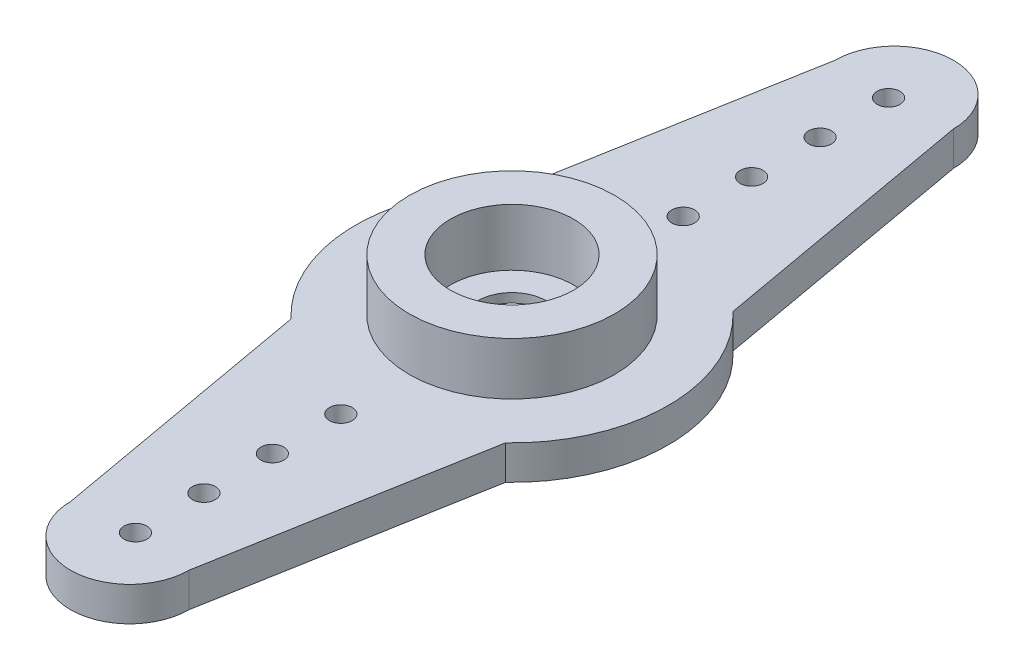
ISO-10303-21;
HEADER;
FILE_DESCRIPTION(('STEP AP214'),'2;1');
FILE_NAME('part.step','',(''),(''),'','','');
FILE_SCHEMA(('AUTOMOTIVE_DESIGN { 1 0 10303 214 1 1 1 1 }'));
ENDSEC;
DATA;
#1=APPLICATION_CONTEXT('core data for automotive mechanical design processes');
#2=APPLICATION_PROTOCOL_DEFINITION('international standard','automotive_design',2000,#1);
#3=PRODUCT_CONTEXT('',#1,'mechanical');
#4=PRODUCT('Part','Part','',(#3));
#5=PRODUCT_RELATED_PRODUCT_CATEGORY('part','',(#4));
#6=PRODUCT_DEFINITION_FORMATION('','',#4);
#7=PRODUCT_DEFINITION_CONTEXT('part definition',#1,'design');
#8=PRODUCT_DEFINITION('design','',#6,#7);
#9=PRODUCT_DEFINITION_SHAPE('','',#8);
#10=(LENGTH_UNIT() NAMED_UNIT(*) SI_UNIT(.MILLI.,.METRE.));
#11=(NAMED_UNIT(*) PLANE_ANGLE_UNIT() SI_UNIT($,.RADIAN.));
#12=(NAMED_UNIT(*) SI_UNIT($,.STERADIAN.) SOLID_ANGLE_UNIT());
#13=UNCERTAINTY_MEASURE_WITH_UNIT(LENGTH_MEASURE(1.E-05),#10,'distance_accuracy_value','');
#14=(GEOMETRIC_REPRESENTATION_CONTEXT(3) GLOBAL_UNCERTAINTY_ASSIGNED_CONTEXT((#13)) GLOBAL_UNIT_ASSIGNED_CONTEXT((#10,
#11,#12)) REPRESENTATION_CONTEXT('',''));
#15=CARTESIAN_POINT('',(0.,0.,0.));
#16=DIRECTION('',(0.,0.,1.));
#17=DIRECTION('',(1.,0.,0.));
#18=AXIS2_PLACEMENT_3D('',#15,#16,#17);
#19=CARTESIAN_POINT('',(0.,3.8,0.));
#20=DIRECTION('',(0.,-1.,0.));
#21=DIRECTION('',(0.,0.,-1.));
#22=AXIS2_PLACEMENT_3D('',#19,#20,#21);
#23=CYLINDRICAL_SURFACE('',#22,1.5);
#24=CARTESIAN_POINT('',(0.,0.9,0.));
#25=DIRECTION('',(0.,-1.,0.));
#26=DIRECTION('',(0.,0.,-1.));
#27=AXIS2_PLACEMENT_3D('',#24,#25,#26);
#28=CIRCLE('',#27,1.5);
#29=CARTESIAN_POINT('',(0.,0.9,-1.5));
#30=VERTEX_POINT('',#29);
#31=EDGE_CURVE('E240',#30,#30,#28,.T.);
#32=ORIENTED_EDGE('',*,*,#31,.T.);
#33=EDGE_LOOP('',(#32));
#34=FACE_BOUND('',#33,.T.);
#35=CARTESIAN_POINT('',(0.,1.3,0.));
#36=DIRECTION('',(0.,1.,0.));
#37=DIRECTION('',(0.,0.,1.));
#38=AXIS2_PLACEMENT_3D('',#35,#36,#37);
#39=CIRCLE('',#38,1.5);
#40=CARTESIAN_POINT('',(0.,1.3,1.5));
#41=VERTEX_POINT('',#40);
#42=EDGE_CURVE('E38',#41,#41,#39,.F.);
#43=ORIENTED_EDGE('',*,*,#42,.F.);
#44=EDGE_LOOP('',(#43));
#45=FACE_BOUND('',#44,.T.);
#46=ADVANCED_FACE('F34',(#34,#45),#23,.F.);
#47=CARTESIAN_POINT('',(0.,1.5,-16.75));
#48=DIRECTION('',(0.,1.,0.));
#49=DIRECTION('',(0.,0.,1.));
#50=AXIS2_PLACEMENT_3D('',#47,#48,#49);
#51=PLANE('',#50);
#52=CARTESIAN_POINT('',(0.,1.5,-16.5));
#53=DIRECTION('',(0.,1.,0.));
#54=DIRECTION('',(0.,0.,1.));
#55=AXIS2_PLACEMENT_3D('',#52,#53,#54);
#56=CIRCLE('',#55,0.500000000000001);
#57=CARTESIAN_POINT('',(0.,1.5,-16.));
#58=VERTEX_POINT('',#57);
#59=EDGE_CURVE('E222',#58,#58,#56,.T.);
#60=ORIENTED_EDGE('',*,*,#59,.F.);
#61=EDGE_LOOP('',(#60));
#62=FACE_BOUND('',#61,.T.);
#63=CARTESIAN_POINT('',(0.,1.5,-10.5));
#64=DIRECTION('',(0.,1.,0.));
#65=DIRECTION('',(0.,0.,1.));
#66=AXIS2_PLACEMENT_3D('',#63,#64,#65);
#67=CIRCLE('',#66,0.5);
#68=CARTESIAN_POINT('',(0.,1.5,-10.));
#69=VERTEX_POINT('',#68);
#70=EDGE_CURVE('E210',#69,#69,#67,.T.);
#71=ORIENTED_EDGE('',*,*,#70,.F.);
#72=EDGE_LOOP('',(#71));
#73=FACE_BOUND('',#72,.T.);
#74=CARTESIAN_POINT('',(0.,1.5,7.5));
#75=DIRECTION('',(0.,1.,0.));
#76=DIRECTION('',(0.,0.,-1.));
#77=AXIS2_PLACEMENT_3D('',#74,#75,#76);
#78=CIRCLE('',#77,0.5);
#79=CARTESIAN_POINT('',(0.,1.5,7.));
#80=VERTEX_POINT('',#79);
#81=EDGE_CURVE('E198',#80,#80,#78,.T.);
#82=ORIENTED_EDGE('',*,*,#81,.F.);
#83=EDGE_LOOP('',(#82));
#84=FACE_BOUND('',#83,.T.);
#85=CARTESIAN_POINT('',(0.,1.5,13.5));
#86=DIRECTION('',(0.,1.,0.));
#87=DIRECTION('',(0.,0.,-1.));
#88=AXIS2_PLACEMENT_3D('',#85,#86,#87);
#89=CIRCLE('',#88,0.500000000000001);
#90=CARTESIAN_POINT('',(0.,1.5,13.));
#91=VERTEX_POINT('',#90);
#92=EDGE_CURVE('E186',#91,#91,#89,.T.);
#93=ORIENTED_EDGE('',*,*,#92,.F.);
#94=EDGE_LOOP('',(#93));
#95=FACE_BOUND('',#94,.T.);
#96=CARTESIAN_POINT('',(0.,1.5,-16.75));
#97=DIRECTION('',(0.,1.,0.));
#98=DIRECTION('',(0.,0.,1.));
#99=AXIS2_PLACEMENT_3D('',#96,#97,#98);
#100=CIRCLE('',#99,2.6);
#101=CARTESIAN_POINT('',(2.6,1.5,-16.75));
#102=VERTEX_POINT('',#101);
#103=CARTESIAN_POINT('',(-2.6,1.5,-16.75));
#104=VERTEX_POINT('',#103);
#105=EDGE_CURVE('E148',#102,#104,#100,.T.);
#106=ORIENTED_EDGE('',*,*,#105,.T.);
#107=DIRECTION('',(-0.175692502443579,0.,0.98444509475395));
#108=VECTOR('',#107,1.);
#109=CARTESIAN_POINT('',(-2.6,1.5,-16.75));
#110=LINE('',#109,#108);
#111=CARTESIAN_POINT('',(-4.7,1.5,-4.98322184936613));
#112=VERTEX_POINT('',#111);
#113=EDGE_CURVE('E95',#104,#112,#110,.T.);
#114=ORIENTED_EDGE('',*,*,#113,.T.);
#115=CARTESIAN_POINT('',(0.,1.5,0.));
#116=DIRECTION('',(0.,1.,0.));
#117=DIRECTION('',(0.,0.,1.));
#118=AXIS2_PLACEMENT_3D('',#115,#116,#117);
#119=CIRCLE('',#118,6.85);
#120=CARTESIAN_POINT('',(-4.7,1.5,4.98322184936613));
#121=VERTEX_POINT('',#120);
#122=EDGE_CURVE('E164',#112,#121,#119,.T.);
#123=ORIENTED_EDGE('',*,*,#122,.T.);
#124=DIRECTION('',(0.175692502443579,0.,0.98444509475395));
#125=VECTOR('',#124,1.);
#126=CARTESIAN_POINT('',(-2.6,1.5,16.75));
#127=LINE('',#126,#125);
#128=CARTESIAN_POINT('',(-2.6,1.5,16.75));
#129=VERTEX_POINT('',#128);
#130=EDGE_CURVE('E177',#121,#129,#127,.T.);
#131=ORIENTED_EDGE('',*,*,#130,.T.);
#132=CARTESIAN_POINT('',(0.,1.5,16.75));
#133=DIRECTION('',(0.,1.,0.));
#134=DIRECTION('',(0.,0.,-1.));
#135=AXIS2_PLACEMENT_3D('',#132,#133,#134);
#136=CIRCLE('',#135,2.6);
#137=CARTESIAN_POINT('',(2.59999999999999,1.5,16.75));
#138=VERTEX_POINT('',#137);
#139=EDGE_CURVE('E115',#129,#138,#136,.T.);
#140=ORIENTED_EDGE('',*,*,#139,.T.);
#141=DIRECTION('',(0.17569250244358,0.,-0.98444509475395));
#142=VECTOR('',#141,1.);
#143=CARTESIAN_POINT('',(2.59999999999999,1.5,16.75));
#144=LINE('',#143,#142);
#145=CARTESIAN_POINT('',(4.7,1.5,4.98322184936613));
#146=VERTEX_POINT('',#145);
#147=EDGE_CURVE('E108',#138,#146,#144,.T.);
#148=ORIENTED_EDGE('',*,*,#147,.T.);
#149=CARTESIAN_POINT('',(0.,1.5,0.));
#150=DIRECTION('',(0.,1.,0.));
#151=DIRECTION('',(0.,0.,1.));
#152=AXIS2_PLACEMENT_3D('',#149,#150,#151);
#153=CIRCLE('',#152,6.85);
#154=CARTESIAN_POINT('',(4.7,1.5,-4.98322184936613));
#155=VERTEX_POINT('',#154);
#156=EDGE_CURVE('E113',#146,#155,#153,.T.);
#157=ORIENTED_EDGE('',*,*,#156,.T.);
#158=DIRECTION('',(-0.175692502443579,0.,-0.98444509475395));
#159=VECTOR('',#158,1.);
#160=CARTESIAN_POINT('',(2.6,1.5,-16.75));
#161=LINE('',#160,#159);
#162=EDGE_CURVE('E52',#155,#102,#161,.T.);
#163=ORIENTED_EDGE('',*,*,#162,.T.);
#164=EDGE_LOOP('',(#106,#114,#123,#131,#140,#148,#157,#163));
#165=FACE_BOUND('',#164,.T.);
#166=CARTESIAN_POINT('',(0.,1.5,16.5));
#167=DIRECTION('',(0.,1.,0.));
#168=DIRECTION('',(0.,0.,-1.));
#169=AXIS2_PLACEMENT_3D('',#166,#167,#168);
#170=CIRCLE('',#169,0.500000000000001);
#171=CARTESIAN_POINT('',(0.,1.5,16.));
#172=VERTEX_POINT('',#171);
#173=EDGE_CURVE('E137',#172,#172,#170,.T.);
#174=ORIENTED_EDGE('',*,*,#173,.F.);
#175=EDGE_LOOP('',(#174));
#176=FACE_BOUND('',#175,.T.);
#177=CARTESIAN_POINT('',(0.,1.5,10.5));
#178=DIRECTION('',(0.,1.,0.));
#179=DIRECTION('',(0.,0.,-1.));
#180=AXIS2_PLACEMENT_3D('',#177,#178,#179);
#181=CIRCLE('',#180,0.5);
#182=CARTESIAN_POINT('',(0.,1.5,10.));
#183=VERTEX_POINT('',#182);
#184=EDGE_CURVE('E192',#183,#183,#181,.T.);
#185=ORIENTED_EDGE('',*,*,#184,.F.);
#186=EDGE_LOOP('',(#185));
#187=FACE_BOUND('',#186,.T.);
#188=CARTESIAN_POINT('',(0.,1.5,-7.5));
#189=DIRECTION('',(0.,1.,0.));
#190=DIRECTION('',(0.,0.,1.));
#191=AXIS2_PLACEMENT_3D('',#188,#189,#190);
#192=CIRCLE('',#191,0.5);
#193=CARTESIAN_POINT('',(0.,1.5,-7.));
#194=VERTEX_POINT('',#193);
#195=EDGE_CURVE('E204',#194,#194,#192,.T.);
#196=ORIENTED_EDGE('',*,*,#195,.F.);
#197=EDGE_LOOP('',(#196));
#198=FACE_BOUND('',#197,.T.);
#199=CARTESIAN_POINT('',(0.,1.5,-13.5));
#200=DIRECTION('',(0.,1.,0.));
#201=DIRECTION('',(0.,0.,1.));
#202=AXIS2_PLACEMENT_3D('',#199,#200,#201);
#203=CIRCLE('',#202,0.500000000000001);
#204=CARTESIAN_POINT('',(0.,1.5,-13.));
#205=VERTEX_POINT('',#204);
#206=EDGE_CURVE('E216',#205,#205,#203,.T.);
#207=ORIENTED_EDGE('',*,*,#206,.F.);
#208=EDGE_LOOP('',(#207));
#209=FACE_BOUND('',#208,.T.);
#210=CARTESIAN_POINT('',(0.,1.5,0.));
#211=DIRECTION('',(0.,1.,0.));
#212=DIRECTION('',(0.,0.,1.));
#213=AXIS2_PLACEMENT_3D('',#210,#211,#212);
#214=CIRCLE('',#213,4.5);
#215=CARTESIAN_POINT('',(0.,1.5,4.5));
#216=VERTEX_POINT('',#215);
#217=EDGE_CURVE('E231',#216,#216,#214,.T.);
#218=ORIENTED_EDGE('',*,*,#217,.F.);
#219=EDGE_LOOP('',(#218));
#220=FACE_BOUND('',#219,.T.);
#221=ADVANCED_FACE('F110',(#62,#73,#84,#95,#165,#176,#187,#198,#209,#220),#51,.T.);
#222=CARTESIAN_POINT('',(0.,0.,-16.75));
#223=DIRECTION('',(0.,1.,0.));
#224=DIRECTION('',(0.,0.,1.));
#225=AXIS2_PLACEMENT_3D('',#222,#223,#224);
#226=PLANE('',#225);
#227=CARTESIAN_POINT('',(0.,0.,0.));
#228=DIRECTION('',(0.,-1.,0.));
#229=DIRECTION('',(0.,0.,-1.));
#230=AXIS2_PLACEMENT_3D('',#227,#228,#229);
#231=CIRCLE('',#230,3.);
#232=CARTESIAN_POINT('',(0.,0.,-3.));
#233=VERTEX_POINT('',#232);
#234=EDGE_CURVE('E237',#233,#233,#231,.T.);
#235=ORIENTED_EDGE('',*,*,#234,.F.);
#236=EDGE_LOOP('',(#235));
#237=FACE_BOUND('',#236,.T.);
#238=CARTESIAN_POINT('',(0.,0.,-13.5));
#239=DIRECTION('',(0.,1.,0.));
#240=DIRECTION('',(0.,0.,1.));
#241=AXIS2_PLACEMENT_3D('',#238,#239,#240);
#242=CIRCLE('',#241,0.500000000000001);
#243=CARTESIAN_POINT('',(0.,0.,-13.));
#244=VERTEX_POINT('',#243);
#245=EDGE_CURVE('E219',#244,#244,#242,.T.);
#246=ORIENTED_EDGE('',*,*,#245,.T.);
#247=EDGE_LOOP('',(#246));
#248=FACE_BOUND('',#247,.T.);
#249=CARTESIAN_POINT('',(0.,0.,-7.5));
#250=DIRECTION('',(0.,1.,0.));
#251=DIRECTION('',(0.,0.,1.));
#252=AXIS2_PLACEMENT_3D('',#249,#250,#251);
#253=CIRCLE('',#252,0.5);
#254=CARTESIAN_POINT('',(0.,0.,-7.));
#255=VERTEX_POINT('',#254);
#256=EDGE_CURVE('E207',#255,#255,#253,.T.);
#257=ORIENTED_EDGE('',*,*,#256,.T.);
#258=EDGE_LOOP('',(#257));
#259=FACE_BOUND('',#258,.T.);
#260=CARTESIAN_POINT('',(0.,0.,10.5));
#261=DIRECTION('',(0.,1.,0.));
#262=DIRECTION('',(0.,0.,-1.));
#263=AXIS2_PLACEMENT_3D('',#260,#261,#262);
#264=CIRCLE('',#263,0.5);
#265=CARTESIAN_POINT('',(0.,0.,10.));
#266=VERTEX_POINT('',#265);
#267=EDGE_CURVE('E195',#266,#266,#264,.T.);
#268=ORIENTED_EDGE('',*,*,#267,.T.);
#269=EDGE_LOOP('',(#268));
#270=FACE_BOUND('',#269,.T.);
#271=CARTESIAN_POINT('',(0.,0.,16.5));
#272=DIRECTION('',(0.,1.,0.));
#273=DIRECTION('',(0.,0.,-1.));
#274=AXIS2_PLACEMENT_3D('',#271,#272,#273);
#275=CIRCLE('',#274,0.500000000000001);
#276=CARTESIAN_POINT('',(0.,0.,16.));
#277=VERTEX_POINT('',#276);
#278=EDGE_CURVE('E183',#277,#277,#275,.T.);
#279=ORIENTED_EDGE('',*,*,#278,.T.);
#280=EDGE_LOOP('',(#279));
#281=FACE_BOUND('',#280,.T.);
#282=CARTESIAN_POINT('',(0.,0.,-16.75));
#283=DIRECTION('',(0.,1.,0.));
#284=DIRECTION('',(0.,0.,1.));
#285=AXIS2_PLACEMENT_3D('',#282,#283,#284);
#286=CIRCLE('',#285,2.6);
#287=CARTESIAN_POINT('',(2.6,0.,-16.75));
#288=VERTEX_POINT('',#287);
#289=CARTESIAN_POINT('',(-2.6,0.,-16.75));
#290=VERTEX_POINT('',#289);
#291=EDGE_CURVE('E133',#288,#290,#286,.T.);
#292=ORIENTED_EDGE('',*,*,#291,.F.);
#293=DIRECTION('',(-0.175692502443579,0.,-0.98444509475395));
#294=VECTOR('',#293,1.);
#295=CARTESIAN_POINT('',(2.6,0.,-16.75));
#296=LINE('',#295,#294);
#297=CARTESIAN_POINT('',(4.7,0.,-4.98322184936613));
#298=VERTEX_POINT('',#297);
#299=EDGE_CURVE('E87',#298,#288,#296,.T.);
#300=ORIENTED_EDGE('',*,*,#299,.F.);
#301=CARTESIAN_POINT('',(0.,0.,0.));
#302=DIRECTION('',(0.,1.,0.));
#303=DIRECTION('',(0.,0.,1.));
#304=AXIS2_PLACEMENT_3D('',#301,#302,#303);
#305=CIRCLE('',#304,6.85);
#306=CARTESIAN_POINT('',(4.7,0.,4.98322184936613));
#307=VERTEX_POINT('',#306);
#308=EDGE_CURVE('E81',#307,#298,#305,.T.);
#309=ORIENTED_EDGE('',*,*,#308,.F.);
#310=DIRECTION('',(0.17569250244358,0.,-0.98444509475395));
#311=VECTOR('',#310,1.);
#312=CARTESIAN_POINT('',(2.59999999999999,0.,16.75));
#313=LINE('',#312,#311);
#314=CARTESIAN_POINT('',(2.59999999999999,0.,16.75));
#315=VERTEX_POINT('',#314);
#316=EDGE_CURVE('E123',#315,#307,#313,.T.);
#317=ORIENTED_EDGE('',*,*,#316,.F.);
#318=CARTESIAN_POINT('',(0.,0.,16.75));
#319=DIRECTION('',(0.,1.,0.));
#320=DIRECTION('',(0.,0.,-1.));
#321=AXIS2_PLACEMENT_3D('',#318,#319,#320);
#322=CIRCLE('',#321,2.6);
#323=CARTESIAN_POINT('',(-2.6,0.,16.75));
#324=VERTEX_POINT('',#323);
#325=EDGE_CURVE('E143',#324,#315,#322,.T.);
#326=ORIENTED_EDGE('',*,*,#325,.F.);
#327=DIRECTION('',(0.175692502443579,0.,0.98444509475395));
#328=VECTOR('',#327,1.);
#329=CARTESIAN_POINT('',(-2.6,0.,16.75));
#330=LINE('',#329,#328);
#331=CARTESIAN_POINT('',(-4.7,0.,4.98322184936613));
#332=VERTEX_POINT('',#331);
#333=EDGE_CURVE('E141',#332,#324,#330,.T.);
#334=ORIENTED_EDGE('',*,*,#333,.F.);
#335=CARTESIAN_POINT('',(0.,0.,0.));
#336=DIRECTION('',(0.,1.,0.));
#337=DIRECTION('',(0.,0.,1.));
#338=AXIS2_PLACEMENT_3D('',#335,#336,#337);
#339=CIRCLE('',#338,6.85);
#340=CARTESIAN_POINT('',(-4.7,0.,-4.98322184936613));
#341=VERTEX_POINT('',#340);
#342=EDGE_CURVE('E139',#341,#332,#339,.T.);
#343=ORIENTED_EDGE('',*,*,#342,.F.);
#344=DIRECTION('',(-0.175692502443579,0.,0.98444509475395));
#345=VECTOR('',#344,1.);
#346=CARTESIAN_POINT('',(-2.6,0.,-16.75));
#347=LINE('',#346,#345);
#348=EDGE_CURVE('E136',#290,#341,#347,.T.);
#349=ORIENTED_EDGE('',*,*,#348,.F.);
#350=EDGE_LOOP('',(#292,#300,#309,#317,#326,#334,#343,#349));
#351=FACE_BOUND('',#350,.T.);
#352=CARTESIAN_POINT('',(0.,0.,13.5));
#353=DIRECTION('',(0.,1.,0.));
#354=DIRECTION('',(0.,0.,-1.));
#355=AXIS2_PLACEMENT_3D('',#352,#353,#354);
#356=CIRCLE('',#355,0.500000000000001);
#357=CARTESIAN_POINT('',(0.,0.,13.));
#358=VERTEX_POINT('',#357);
#359=EDGE_CURVE('E189',#358,#358,#356,.T.);
#360=ORIENTED_EDGE('',*,*,#359,.T.);
#361=EDGE_LOOP('',(#360));
#362=FACE_BOUND('',#361,.T.);
#363=CARTESIAN_POINT('',(0.,0.,7.5));
#364=DIRECTION('',(0.,1.,0.));
#365=DIRECTION('',(0.,0.,-1.));
#366=AXIS2_PLACEMENT_3D('',#363,#364,#365);
#367=CIRCLE('',#366,0.5);
#368=CARTESIAN_POINT('',(0.,0.,7.));
#369=VERTEX_POINT('',#368);
#370=EDGE_CURVE('E201',#369,#369,#367,.T.);
#371=ORIENTED_EDGE('',*,*,#370,.T.);
#372=EDGE_LOOP('',(#371));
#373=FACE_BOUND('',#372,.T.);
#374=CARTESIAN_POINT('',(0.,0.,-10.5));
#375=DIRECTION('',(0.,1.,0.));
#376=DIRECTION('',(0.,0.,1.));
#377=AXIS2_PLACEMENT_3D('',#374,#375,#376);
#378=CIRCLE('',#377,0.5);
#379=CARTESIAN_POINT('',(0.,0.,-10.));
#380=VERTEX_POINT('',#379);
#381=EDGE_CURVE('E213',#380,#380,#378,.T.);
#382=ORIENTED_EDGE('',*,*,#381,.T.);
#383=EDGE_LOOP('',(#382));
#384=FACE_BOUND('',#383,.T.);
#385=CARTESIAN_POINT('',(0.,0.,-16.5));
#386=DIRECTION('',(0.,1.,0.));
#387=DIRECTION('',(0.,0.,1.));
#388=AXIS2_PLACEMENT_3D('',#385,#386,#387);
#389=CIRCLE('',#388,0.500000000000001);
#390=CARTESIAN_POINT('',(0.,0.,-16.));
#391=VERTEX_POINT('',#390);
#392=EDGE_CURVE('E225',#391,#391,#389,.T.);
#393=ORIENTED_EDGE('',*,*,#392,.T.);
#394=EDGE_LOOP('',(#393));
#395=FACE_BOUND('',#394,.T.);
#396=ADVANCED_FACE('F168',(#237,#248,#259,#270,#281,#351,#362,#373,#384,#395),#226,.F.);
#397=CARTESIAN_POINT('',(0.,1.5,-16.75));
#398=DIRECTION('',(0.,-1.,0.));
#399=DIRECTION('',(0.,0.,-1.));
#400=AXIS2_PLACEMENT_3D('',#397,#398,#399);
#401=CYLINDRICAL_SURFACE('',#400,2.6);
#402=ORIENTED_EDGE('',*,*,#291,.T.);
#403=DIRECTION('',(0.,-1.,0.));
#404=VECTOR('',#403,1.);
#405=CARTESIAN_POINT('',(-2.6,1.5,-16.75));
#406=LINE('',#405,#404);
#407=EDGE_CURVE('E11',#104,#290,#406,.T.);
#408=ORIENTED_EDGE('',*,*,#407,.F.);
#409=ORIENTED_EDGE('',*,*,#105,.F.);
#410=DIRECTION('',(0.,-1.,0.));
#411=VECTOR('',#410,1.);
#412=CARTESIAN_POINT('',(2.6,1.5,-16.75));
#413=LINE('',#412,#411);
#414=EDGE_CURVE('E129',#102,#288,#413,.T.);
#415=ORIENTED_EDGE('',*,*,#414,.T.);
#416=EDGE_LOOP('',(#402,#408,#409,#415));
#417=FACE_BOUND('',#416,.T.);
#418=ADVANCED_FACE('F36',(#417),#401,.T.);
#419=CARTESIAN_POINT('',(-2.6,1.5,-16.75));
#420=DIRECTION('',(0.98444509475395,0.,0.175692502443579));
#421=DIRECTION('',(0.175692502443579,0.,-0.98444509475395));
#422=AXIS2_PLACEMENT_3D('',#419,#420,#421);
#423=PLANE('',#422);
#424=ORIENTED_EDGE('',*,*,#348,.T.);
#425=DIRECTION('',(0.,-1.,0.));
#426=VECTOR('',#425,1.);
#427=CARTESIAN_POINT('',(-4.7,1.5,-4.98322184936613));
#428=LINE('',#427,#426);
#429=EDGE_CURVE('E44',#112,#341,#428,.T.);
#430=ORIENTED_EDGE('',*,*,#429,.F.);
#431=ORIENTED_EDGE('',*,*,#113,.F.);
#432=ORIENTED_EDGE('',*,*,#407,.T.);
#433=EDGE_LOOP('',(#424,#430,#431,#432));
#434=FACE_BOUND('',#433,.T.);
#435=ADVANCED_FACE('F332',(#434),#423,.F.);
#436=CARTESIAN_POINT('',(0.,1.5,0.));
#437=DIRECTION('',(0.,-1.,0.));
#438=DIRECTION('',(0.,0.,-1.));
#439=AXIS2_PLACEMENT_3D('',#436,#437,#438);
#440=CYLINDRICAL_SURFACE('',#439,6.85);
#441=ORIENTED_EDGE('',*,*,#342,.T.);
#442=DIRECTION('',(0.,-1.,0.));
#443=VECTOR('',#442,1.);
#444=CARTESIAN_POINT('',(-4.7,1.5,4.98322184936613));
#445=LINE('',#444,#443);
#446=EDGE_CURVE('E155',#121,#332,#445,.T.);
#447=ORIENTED_EDGE('',*,*,#446,.F.);
#448=ORIENTED_EDGE('',*,*,#122,.F.);
#449=ORIENTED_EDGE('',*,*,#429,.T.);
#450=EDGE_LOOP('',(#441,#447,#448,#449));
#451=FACE_BOUND('',#450,.T.);
#452=ADVANCED_FACE('F162',(#451),#440,.T.);
#453=CARTESIAN_POINT('',(-2.6,1.5,16.75));
#454=DIRECTION('',(0.98444509475395,0.,-0.175692502443579));
#455=DIRECTION('',(-0.175692502443579,0.,-0.98444509475395));
#456=AXIS2_PLACEMENT_3D('',#453,#454,#455);
#457=PLANE('',#456);
#458=ORIENTED_EDGE('',*,*,#333,.T.);
#459=DIRECTION('',(0.,-1.,0.));
#460=VECTOR('',#459,1.);
#461=CARTESIAN_POINT('',(-2.6,1.5,16.75));
#462=LINE('',#461,#460);
#463=EDGE_CURVE('E152',#129,#324,#462,.T.);
#464=ORIENTED_EDGE('',*,*,#463,.F.);
#465=ORIENTED_EDGE('',*,*,#130,.F.);
#466=ORIENTED_EDGE('',*,*,#446,.T.);
#467=EDGE_LOOP('',(#458,#464,#465,#466));
#468=FACE_BOUND('',#467,.T.);
#469=ADVANCED_FACE('F173',(#468),#457,.F.);
#470=CARTESIAN_POINT('',(0.,1.5,16.75));
#471=DIRECTION('',(0.,-1.,0.));
#472=DIRECTION('',(0.,0.,-1.));
#473=AXIS2_PLACEMENT_3D('',#470,#471,#472);
#474=CYLINDRICAL_SURFACE('',#473,2.6);
#475=ORIENTED_EDGE('',*,*,#325,.T.);
#476=DIRECTION('',(0.,-1.,0.));
#477=VECTOR('',#476,1.);
#478=CARTESIAN_POINT('',(2.59999999999999,1.5,16.75));
#479=LINE('',#478,#477);
#480=EDGE_CURVE('E124',#138,#315,#479,.T.);
#481=ORIENTED_EDGE('',*,*,#480,.F.);
#482=ORIENTED_EDGE('',*,*,#139,.F.);
#483=ORIENTED_EDGE('',*,*,#463,.T.);
#484=EDGE_LOOP('',(#475,#481,#482,#483));
#485=FACE_BOUND('',#484,.T.);
#486=ADVANCED_FACE('F176',(#485),#474,.T.);
#487=CARTESIAN_POINT('',(2.59999999999999,1.5,16.75));
#488=DIRECTION('',(-0.984445094753949,0.,-0.17569250244358));
#489=DIRECTION('',(-0.17569250244358,0.,0.98444509475395));
#490=AXIS2_PLACEMENT_3D('',#487,#488,#489);
#491=PLANE('',#490);
#492=ORIENTED_EDGE('',*,*,#316,.T.);
#493=DIRECTION('',(0.,-1.,0.));
#494=VECTOR('',#493,1.);
#495=CARTESIAN_POINT('',(4.7,1.5,4.98322184936613));
#496=LINE('',#495,#494);
#497=EDGE_CURVE('E120',#146,#307,#496,.T.);
#498=ORIENTED_EDGE('',*,*,#497,.F.);
#499=ORIENTED_EDGE('',*,*,#147,.F.);
#500=ORIENTED_EDGE('',*,*,#480,.T.);
#501=EDGE_LOOP('',(#492,#498,#499,#500));
#502=FACE_BOUND('',#501,.T.);
#503=ADVANCED_FACE('F121',(#502),#491,.F.);
#504=CARTESIAN_POINT('',(0.,1.5,0.));
#505=DIRECTION('',(0.,-1.,0.));
#506=DIRECTION('',(0.,0.,-1.));
#507=AXIS2_PLACEMENT_3D('',#504,#505,#506);
#508=CYLINDRICAL_SURFACE('',#507,6.85);
#509=ORIENTED_EDGE('',*,*,#308,.T.);
#510=DIRECTION('',(0.,-1.,0.));
#511=VECTOR('',#510,1.);
#512=CARTESIAN_POINT('',(4.7,1.5,-4.98322184936613));
#513=LINE('',#512,#511);
#514=EDGE_CURVE('E125',#155,#298,#513,.T.);
#515=ORIENTED_EDGE('',*,*,#514,.F.);
#516=ORIENTED_EDGE('',*,*,#156,.F.);
#517=ORIENTED_EDGE('',*,*,#497,.T.);
#518=EDGE_LOOP('',(#509,#515,#516,#517));
#519=FACE_BOUND('',#518,.T.);
#520=ADVANCED_FACE('F127',(#519),#508,.T.);
#521=CARTESIAN_POINT('',(2.6,1.5,-16.75));
#522=DIRECTION('',(-0.98444509475395,0.,0.175692502443579));
#523=DIRECTION('',(0.175692502443579,0.,0.98444509475395));
#524=AXIS2_PLACEMENT_3D('',#521,#522,#523);
#525=PLANE('',#524);
#526=ORIENTED_EDGE('',*,*,#299,.T.);
#527=ORIENTED_EDGE('',*,*,#414,.F.);
#528=ORIENTED_EDGE('',*,*,#162,.F.);
#529=ORIENTED_EDGE('',*,*,#514,.T.);
#530=EDGE_LOOP('',(#526,#527,#528,#529));
#531=FACE_BOUND('',#530,.T.);
#532=ADVANCED_FACE('F315',(#531),#525,.F.);
#533=CARTESIAN_POINT('',(0.,1.5,16.5));
#534=DIRECTION('',(0.,-1.,0.));
#535=DIRECTION('',(0.,0.,-1.));
#536=AXIS2_PLACEMENT_3D('',#533,#534,#535);
#537=CYLINDRICAL_SURFACE('',#536,0.500000000000001);
#538=ORIENTED_EDGE('',*,*,#173,.T.);
#539=EDGE_LOOP('',(#538));
#540=FACE_BOUND('',#539,.T.);
#541=ORIENTED_EDGE('',*,*,#278,.F.);
#542=EDGE_LOOP('',(#541));
#543=FACE_BOUND('',#542,.T.);
#544=ADVANCED_FACE('F312',(#540,#543),#537,.F.);
#545=CARTESIAN_POINT('',(0.,1.5,13.5));
#546=DIRECTION('',(0.,-1.,0.));
#547=DIRECTION('',(0.,0.,-1.));
#548=AXIS2_PLACEMENT_3D('',#545,#546,#547);
#549=CYLINDRICAL_SURFACE('',#548,0.500000000000001);
#550=ORIENTED_EDGE('',*,*,#92,.T.);
#551=EDGE_LOOP('',(#550));
#552=FACE_BOUND('',#551,.T.);
#553=ORIENTED_EDGE('',*,*,#359,.F.);
#554=EDGE_LOOP('',(#553));
#555=FACE_BOUND('',#554,.T.);
#556=ADVANCED_FACE('F308',(#552,#555),#549,.F.);
#557=CARTESIAN_POINT('',(0.,1.5,10.5));
#558=DIRECTION('',(0.,-1.,0.));
#559=DIRECTION('',(0.,0.,-1.));
#560=AXIS2_PLACEMENT_3D('',#557,#558,#559);
#561=CYLINDRICAL_SURFACE('',#560,0.5);
#562=ORIENTED_EDGE('',*,*,#184,.T.);
#563=EDGE_LOOP('',(#562));
#564=FACE_BOUND('',#563,.T.);
#565=ORIENTED_EDGE('',*,*,#267,.F.);
#566=EDGE_LOOP('',(#565));
#567=FACE_BOUND('',#566,.T.);
#568=ADVANCED_FACE('F304',(#564,#567),#561,.F.);
#569=CARTESIAN_POINT('',(0.,1.5,7.5));
#570=DIRECTION('',(0.,-1.,0.));
#571=DIRECTION('',(0.,0.,-1.));
#572=AXIS2_PLACEMENT_3D('',#569,#570,#571);
#573=CYLINDRICAL_SURFACE('',#572,0.5);
#574=ORIENTED_EDGE('',*,*,#81,.T.);
#575=EDGE_LOOP('',(#574));
#576=FACE_BOUND('',#575,.T.);
#577=ORIENTED_EDGE('',*,*,#370,.F.);
#578=EDGE_LOOP('',(#577));
#579=FACE_BOUND('',#578,.T.);
#580=ADVANCED_FACE('F300',(#576,#579),#573,.F.);
#581=CARTESIAN_POINT('',(0.,1.5,-7.5));
#582=DIRECTION('',(0.,-1.,0.));
#583=DIRECTION('',(0.,0.,-1.));
#584=AXIS2_PLACEMENT_3D('',#581,#582,#583);
#585=CYLINDRICAL_SURFACE('',#584,0.5);
#586=ORIENTED_EDGE('',*,*,#195,.T.);
#587=EDGE_LOOP('',(#586));
#588=FACE_BOUND('',#587,.T.);
#589=ORIENTED_EDGE('',*,*,#256,.F.);
#590=EDGE_LOOP('',(#589));
#591=FACE_BOUND('',#590,.T.);
#592=ADVANCED_FACE('F296',(#588,#591),#585,.F.);
#593=CARTESIAN_POINT('',(0.,1.5,-10.5));
#594=DIRECTION('',(0.,-1.,0.));
#595=DIRECTION('',(0.,0.,-1.));
#596=AXIS2_PLACEMENT_3D('',#593,#594,#595);
#597=CYLINDRICAL_SURFACE('',#596,0.5);
#598=ORIENTED_EDGE('',*,*,#70,.T.);
#599=EDGE_LOOP('',(#598));
#600=FACE_BOUND('',#599,.T.);
#601=ORIENTED_EDGE('',*,*,#381,.F.);
#602=EDGE_LOOP('',(#601));
#603=FACE_BOUND('',#602,.T.);
#604=ADVANCED_FACE('F292',(#600,#603),#597,.F.);
#605=CARTESIAN_POINT('',(0.,1.5,-13.5));
#606=DIRECTION('',(0.,-1.,0.));
#607=DIRECTION('',(0.,0.,-1.));
#608=AXIS2_PLACEMENT_3D('',#605,#606,#607);
#609=CYLINDRICAL_SURFACE('',#608,0.500000000000001);
#610=ORIENTED_EDGE('',*,*,#206,.T.);
#611=EDGE_LOOP('',(#610));
#612=FACE_BOUND('',#611,.T.);
#613=ORIENTED_EDGE('',*,*,#245,.F.);
#614=EDGE_LOOP('',(#613));
#615=FACE_BOUND('',#614,.T.);
#616=ADVANCED_FACE('F288',(#612,#615),#609,.F.);
#617=CARTESIAN_POINT('',(0.,1.5,-16.5));
#618=DIRECTION('',(0.,-1.,0.));
#619=DIRECTION('',(0.,0.,-1.));
#620=AXIS2_PLACEMENT_3D('',#617,#618,#619);
#621=CYLINDRICAL_SURFACE('',#620,0.500000000000001);
#622=ORIENTED_EDGE('',*,*,#59,.T.);
#623=EDGE_LOOP('',(#622));
#624=FACE_BOUND('',#623,.T.);
#625=ORIENTED_EDGE('',*,*,#392,.F.);
#626=EDGE_LOOP('',(#625));
#627=FACE_BOUND('',#626,.T.);
#628=ADVANCED_FACE('F284',(#624,#627),#621,.F.);
#629=CARTESIAN_POINT('',(0.,3.8,0.));
#630=DIRECTION('',(0.,-1.,0.));
#631=DIRECTION('',(0.,0.,-1.));
#632=AXIS2_PLACEMENT_3D('',#629,#630,#631);
#633=CYLINDRICAL_SURFACE('',#632,4.5);
#634=CARTESIAN_POINT('',(0.,3.8,0.));
#635=DIRECTION('',(0.,1.,0.));
#636=DIRECTION('',(0.,0.,1.));
#637=AXIS2_PLACEMENT_3D('',#634,#635,#636);
#638=CIRCLE('',#637,4.5);
#639=CARTESIAN_POINT('',(0.,3.8,4.5));
#640=VERTEX_POINT('',#639);
#641=EDGE_CURVE('E228',#640,#640,#638,.T.);
#642=ORIENTED_EDGE('',*,*,#641,.F.);
#643=EDGE_LOOP('',(#642));
#644=FACE_BOUND('',#643,.T.);
#645=ORIENTED_EDGE('',*,*,#217,.T.);
#646=EDGE_LOOP('',(#645));
#647=FACE_BOUND('',#646,.T.);
#648=ADVANCED_FACE('F280',(#644,#647),#633,.T.);
#649=CARTESIAN_POINT('',(0.,3.8,0.));
#650=DIRECTION('',(0.,1.,0.));
#651=DIRECTION('',(0.,0.,1.));
#652=AXIS2_PLACEMENT_3D('',#649,#650,#651);
#653=PLANE('',#652);
#654=CARTESIAN_POINT('',(0.,3.8,0.));
#655=DIRECTION('',(0.,1.,0.));
#656=DIRECTION('',(0.,0.,1.));
#657=AXIS2_PLACEMENT_3D('',#654,#655,#656);
#658=CIRCLE('',#657,2.7);
#659=CARTESIAN_POINT('',(0.,3.8,2.7));
#660=VERTEX_POINT('',#659);
#661=EDGE_CURVE('E245',#660,#660,#658,.T.);
#662=ORIENTED_EDGE('',*,*,#661,.F.);
#663=EDGE_LOOP('',(#662));
#664=FACE_BOUND('',#663,.T.);
#665=ORIENTED_EDGE('',*,*,#641,.T.);
#666=EDGE_LOOP('',(#665));
#667=FACE_BOUND('',#666,.T.);
#668=ADVANCED_FACE('F276',(#664,#667),#653,.T.);
#669=CARTESIAN_POINT('',(0.,0.9,0.));
#670=DIRECTION('',(0.,-1.,0.));
#671=DIRECTION('',(0.,0.,-1.));
#672=AXIS2_PLACEMENT_3D('',#669,#670,#671);
#673=CYLINDRICAL_SURFACE('',#672,3.);
#674=CARTESIAN_POINT('',(0.,0.9,0.));
#675=DIRECTION('',(0.,-1.,0.));
#676=DIRECTION('',(0.,0.,-1.));
#677=AXIS2_PLACEMENT_3D('',#674,#675,#676);
#678=CIRCLE('',#677,3.);
#679=CARTESIAN_POINT('',(0.,0.9,-3.));
#680=VERTEX_POINT('',#679);
#681=EDGE_CURVE('E234',#680,#680,#678,.T.);
#682=ORIENTED_EDGE('',*,*,#681,.F.);
#683=EDGE_LOOP('',(#682));
#684=FACE_BOUND('',#683,.T.);
#685=ORIENTED_EDGE('',*,*,#234,.T.);
#686=EDGE_LOOP('',(#685));
#687=FACE_BOUND('',#686,.T.);
#688=ADVANCED_FACE('F272',(#684,#687),#673,.F.);
#689=CARTESIAN_POINT('',(0.,0.9,0.));
#690=DIRECTION('',(0.,-1.,0.));
#691=DIRECTION('',(0.,0.,-1.));
#692=AXIS2_PLACEMENT_3D('',#689,#690,#691);
#693=PLANE('',#692);
#694=ORIENTED_EDGE('',*,*,#31,.F.);
#695=EDGE_LOOP('',(#694));
#696=FACE_BOUND('',#695,.T.);
#697=ORIENTED_EDGE('',*,*,#681,.T.);
#698=EDGE_LOOP('',(#697));
#699=FACE_BOUND('',#698,.T.);
#700=ADVANCED_FACE('F269',(#696,#699),#693,.T.);
#701=CARTESIAN_POINT('',(0.,1.3,0.));
#702=DIRECTION('',(0.,1.,0.));
#703=DIRECTION('',(0.,0.,1.));
#704=AXIS2_PLACEMENT_3D('',#701,#702,#703);
#705=PLANE('',#704);
#706=CARTESIAN_POINT('',(0.,1.3,0.));
#707=DIRECTION('',(0.,1.,0.));
#708=DIRECTION('',(0.,0.,1.));
#709=AXIS2_PLACEMENT_3D('',#706,#707,#708);
#710=CIRCLE('',#709,2.7);
#711=CARTESIAN_POINT('',(0.,1.3,2.7));
#712=VERTEX_POINT('',#711);
#713=EDGE_CURVE('E248',#712,#712,#710,.T.);
#714=ORIENTED_EDGE('',*,*,#713,.T.);
#715=EDGE_LOOP('',(#714));
#716=FACE_BOUND('',#715,.T.);
#717=ORIENTED_EDGE('',*,*,#42,.T.);
#718=EDGE_LOOP('',(#717));
#719=FACE_BOUND('',#718,.T.);
#720=ADVANCED_FACE('F255',(#716,#719),#705,.T.);
#721=CARTESIAN_POINT('',(0.,1.3,0.));
#722=DIRECTION('',(0.,1.,0.));
#723=DIRECTION('',(0.,0.,1.));
#724=AXIS2_PLACEMENT_3D('',#721,#722,#723);
#725=CYLINDRICAL_SURFACE('',#724,2.7);
#726=ORIENTED_EDGE('',*,*,#713,.F.);
#727=EDGE_LOOP('',(#726));
#728=FACE_BOUND('',#727,.T.);
#729=ORIENTED_EDGE('',*,*,#661,.T.);
#730=EDGE_LOOP('',(#729));
#731=FACE_BOUND('',#730,.T.);
#732=ADVANCED_FACE('F267',(#728,#731),#725,.F.);
#733=CLOSED_SHELL('',(#46,#221,#396,#418,#435,#452,#469,#486,#503,#520,#532,#544,#556,#568,#580,
#592,#604,#616,#628,#648,#668,#688,#700,#720,#732));
#734=MANIFOLD_SOLID_BREP('B2',#733);
#735=ADVANCED_BREP_SHAPE_REPRESENTATION('',(#18,#734),#14);
#736=SHAPE_DEFINITION_REPRESENTATION(#9,#735);
ENDSEC;
END-ISO-10303-21;
